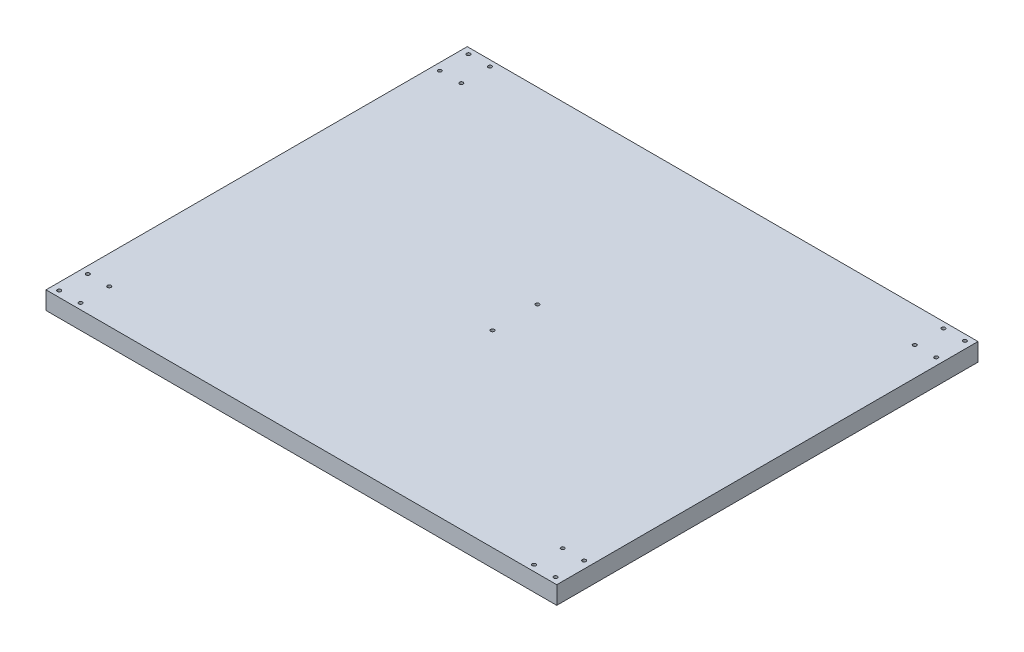
ISO-10303-21;
HEADER;
FILE_DESCRIPTION(('STEP AP214'),'2;1');
FILE_NAME('part.step','',(''),(''),'','','');
FILE_SCHEMA(('AUTOMOTIVE_DESIGN { 1 0 10303 214 1 1 1 1 }'));
ENDSEC;
DATA;
#1=APPLICATION_CONTEXT('core data for automotive mechanical design processes');
#2=APPLICATION_PROTOCOL_DEFINITION('international standard','automotive_design',2000,#1);
#3=PRODUCT_CONTEXT('',#1,'mechanical');
#4=PRODUCT('Part','Part','',(#3));
#5=PRODUCT_RELATED_PRODUCT_CATEGORY('part','',(#4));
#6=PRODUCT_DEFINITION_FORMATION('','',#4);
#7=PRODUCT_DEFINITION_CONTEXT('part definition',#1,'design');
#8=PRODUCT_DEFINITION('design','',#6,#7);
#9=PRODUCT_DEFINITION_SHAPE('','',#8);
#10=(LENGTH_UNIT() NAMED_UNIT(*) SI_UNIT(.MILLI.,.METRE.));
#11=(NAMED_UNIT(*) PLANE_ANGLE_UNIT() SI_UNIT($,.RADIAN.));
#12=(NAMED_UNIT(*) SI_UNIT($,.STERADIAN.) SOLID_ANGLE_UNIT());
#13=UNCERTAINTY_MEASURE_WITH_UNIT(LENGTH_MEASURE(1.E-05),#10,'distance_accuracy_value','');
#14=(GEOMETRIC_REPRESENTATION_CONTEXT(3) GLOBAL_UNCERTAINTY_ASSIGNED_CONTEXT((#13)) GLOBAL_UNIT_ASSIGNED_CONTEXT((#10,
#11,#12)) REPRESENTATION_CONTEXT('',''));
#15=CARTESIAN_POINT('',(0.,0.,0.));
#16=DIRECTION('',(0.,0.,1.));
#17=DIRECTION('',(1.,0.,0.));
#18=AXIS2_PLACEMENT_3D('',#15,#16,#17);
#19=CARTESIAN_POINT('',(0.,15.,0.));
#20=DIRECTION('',(0.,-1.,0.));
#21=DIRECTION('',(0.,0.,-1.));
#22=AXIS2_PLACEMENT_3D('',#19,#20,#21);
#23=PLANE('',#22);
#24=CARTESIAN_POINT('',(208.,15.,-147.5));
#25=DIRECTION('',(0.,1.,0.));
#26=DIRECTION('',(0.,0.,-1.));
#27=AXIS2_PLACEMENT_3D('',#24,#25,#26);
#28=CIRCLE('',#27,1.5);
#29=CARTESIAN_POINT('',(208.,15.,-149.));
#30=VERTEX_POINT('',#29);
#31=EDGE_CURVE('E214',#30,#30,#28,.T.);
#32=ORIENTED_EDGE('',*,*,#31,.F.);
#33=EDGE_LOOP('',(#32));
#34=FACE_BOUND('',#33,.T.);
#35=CARTESIAN_POINT('',(190.,15.,-147.5));
#36=DIRECTION('',(0.,1.,0.));
#37=DIRECTION('',(0.,0.,-1.));
#38=AXIS2_PLACEMENT_3D('',#35,#36,#37);
#39=CIRCLE('',#38,1.5);
#40=CARTESIAN_POINT('',(190.,15.,-149.));
#41=VERTEX_POINT('',#40);
#42=EDGE_CURVE('E208',#41,#41,#39,.T.);
#43=ORIENTED_EDGE('',*,*,#42,.F.);
#44=EDGE_LOOP('',(#43));
#45=FACE_BOUND('',#44,.T.);
#46=CARTESIAN_POINT('',(190.,15.,-171.5));
#47=DIRECTION('',(0.,1.,0.));
#48=DIRECTION('',(0.,0.,-1.));
#49=AXIS2_PLACEMENT_3D('',#46,#47,#48);
#50=CIRCLE('',#49,1.5);
#51=CARTESIAN_POINT('',(190.,15.,-173.));
#52=VERTEX_POINT('',#51);
#53=EDGE_CURVE('E202',#52,#52,#50,.T.);
#54=ORIENTED_EDGE('',*,*,#53,.F.);
#55=EDGE_LOOP('',(#54));
#56=FACE_BOUND('',#55,.T.);
#57=CARTESIAN_POINT('',(208.,15.,-171.5));
#58=DIRECTION('',(0.,1.,0.));
#59=DIRECTION('',(0.,0.,-1.));
#60=AXIS2_PLACEMENT_3D('',#57,#58,#59);
#61=CIRCLE('',#60,1.5);
#62=CARTESIAN_POINT('',(208.,15.,-173.));
#63=VERTEX_POINT('',#62);
#64=EDGE_CURVE('E196',#63,#63,#61,.T.);
#65=ORIENTED_EDGE('',*,*,#64,.F.);
#66=EDGE_LOOP('',(#65));
#67=FACE_BOUND('',#66,.T.);
#68=CARTESIAN_POINT('',(-208.,15.,-147.5));
#69=DIRECTION('',(0.,1.,0.));
#70=DIRECTION('',(0.,0.,1.));
#71=AXIS2_PLACEMENT_3D('',#68,#69,#70);
#72=CIRCLE('',#71,1.5);
#73=CARTESIAN_POINT('',(-208.,15.,-146.));
#74=VERTEX_POINT('',#73);
#75=EDGE_CURVE('E190',#74,#74,#72,.T.);
#76=ORIENTED_EDGE('',*,*,#75,.F.);
#77=EDGE_LOOP('',(#76));
#78=FACE_BOUND('',#77,.T.);
#79=CARTESIAN_POINT('',(-190.,15.,-147.5));
#80=DIRECTION('',(0.,1.,0.));
#81=DIRECTION('',(0.,0.,1.));
#82=AXIS2_PLACEMENT_3D('',#79,#80,#81);
#83=CIRCLE('',#82,1.5);
#84=CARTESIAN_POINT('',(-190.,15.,-146.));
#85=VERTEX_POINT('',#84);
#86=EDGE_CURVE('E184',#85,#85,#83,.T.);
#87=ORIENTED_EDGE('',*,*,#86,.F.);
#88=EDGE_LOOP('',(#87));
#89=FACE_BOUND('',#88,.T.);
#90=CARTESIAN_POINT('',(-190.,15.,-171.5));
#91=DIRECTION('',(0.,1.,0.));
#92=DIRECTION('',(0.,0.,1.));
#93=AXIS2_PLACEMENT_3D('',#90,#91,#92);
#94=CIRCLE('',#93,1.5);
#95=CARTESIAN_POINT('',(-190.,15.,-170.));
#96=VERTEX_POINT('',#95);
#97=EDGE_CURVE('E178',#96,#96,#94,.T.);
#98=ORIENTED_EDGE('',*,*,#97,.F.);
#99=EDGE_LOOP('',(#98));
#100=FACE_BOUND('',#99,.T.);
#101=CARTESIAN_POINT('',(-208.,15.,-171.5));
#102=DIRECTION('',(0.,1.,0.));
#103=DIRECTION('',(0.,0.,1.));
#104=AXIS2_PLACEMENT_3D('',#101,#102,#103);
#105=CIRCLE('',#104,1.5);
#106=CARTESIAN_POINT('',(-208.,15.,-170.));
#107=VERTEX_POINT('',#106);
#108=EDGE_CURVE('E172',#107,#107,#105,.T.);
#109=ORIENTED_EDGE('',*,*,#108,.F.);
#110=EDGE_LOOP('',(#109));
#111=FACE_BOUND('',#110,.T.);
#112=CARTESIAN_POINT('',(-190.,15.,147.5));
#113=DIRECTION('',(0.,1.,0.));
#114=DIRECTION('',(0.,0.,-1.));
#115=AXIS2_PLACEMENT_3D('',#112,#113,#114);
#116=CIRCLE('',#115,1.5);
#117=CARTESIAN_POINT('',(-190.,15.,146.));
#118=VERTEX_POINT('',#117);
#119=EDGE_CURVE('E166',#118,#118,#116,.T.);
#120=ORIENTED_EDGE('',*,*,#119,.F.);
#121=EDGE_LOOP('',(#120));
#122=FACE_BOUND('',#121,.T.);
#123=CARTESIAN_POINT('',(-208.,15.,147.5));
#124=DIRECTION('',(0.,1.,0.));
#125=DIRECTION('',(0.,0.,-1.));
#126=AXIS2_PLACEMENT_3D('',#123,#124,#125);
#127=CIRCLE('',#126,1.5);
#128=CARTESIAN_POINT('',(-208.,15.,146.));
#129=VERTEX_POINT('',#128);
#130=EDGE_CURVE('E160',#129,#129,#127,.T.);
#131=ORIENTED_EDGE('',*,*,#130,.F.);
#132=EDGE_LOOP('',(#131));
#133=FACE_BOUND('',#132,.T.);
#134=CARTESIAN_POINT('',(-190.,15.,171.5));
#135=DIRECTION('',(0.,1.,0.));
#136=DIRECTION('',(0.,0.,-1.));
#137=AXIS2_PLACEMENT_3D('',#134,#135,#136);
#138=CIRCLE('',#137,1.5);
#139=CARTESIAN_POINT('',(-190.,15.,170.));
#140=VERTEX_POINT('',#139);
#141=EDGE_CURVE('E154',#140,#140,#138,.T.);
#142=ORIENTED_EDGE('',*,*,#141,.F.);
#143=EDGE_LOOP('',(#142));
#144=FACE_BOUND('',#143,.T.);
#145=CARTESIAN_POINT('',(-208.,15.,171.5));
#146=DIRECTION('',(0.,1.,0.));
#147=DIRECTION('',(0.,0.,-1.));
#148=AXIS2_PLACEMENT_3D('',#145,#146,#147);
#149=CIRCLE('',#148,1.5);
#150=CARTESIAN_POINT('',(-208.,15.,170.));
#151=VERTEX_POINT('',#150);
#152=EDGE_CURVE('E148',#151,#151,#149,.T.);
#153=ORIENTED_EDGE('',*,*,#152,.F.);
#154=EDGE_LOOP('',(#153));
#155=FACE_BOUND('',#154,.T.);
#156=CARTESIAN_POINT('',(208.,15.,147.5));
#157=DIRECTION('',(0.,1.,0.));
#158=DIRECTION('',(0.,0.,1.));
#159=AXIS2_PLACEMENT_3D('',#156,#157,#158);
#160=CIRCLE('',#159,1.5);
#161=CARTESIAN_POINT('',(208.,15.,149.));
#162=VERTEX_POINT('',#161);
#163=EDGE_CURVE('E142',#162,#162,#160,.T.);
#164=ORIENTED_EDGE('',*,*,#163,.F.);
#165=EDGE_LOOP('',(#164));
#166=FACE_BOUND('',#165,.T.);
#167=CARTESIAN_POINT('',(190.,15.,147.5));
#168=DIRECTION('',(0.,1.,0.));
#169=DIRECTION('',(0.,0.,1.));
#170=AXIS2_PLACEMENT_3D('',#167,#168,#169);
#171=CIRCLE('',#170,1.5);
#172=CARTESIAN_POINT('',(190.,15.,149.));
#173=VERTEX_POINT('',#172);
#174=EDGE_CURVE('E136',#173,#173,#171,.T.);
#175=ORIENTED_EDGE('',*,*,#174,.F.);
#176=EDGE_LOOP('',(#175));
#177=FACE_BOUND('',#176,.T.);
#178=CARTESIAN_POINT('',(190.,15.,171.5));
#179=DIRECTION('',(0.,1.,0.));
#180=DIRECTION('',(0.,0.,1.));
#181=AXIS2_PLACEMENT_3D('',#178,#179,#180);
#182=CIRCLE('',#181,1.5);
#183=CARTESIAN_POINT('',(190.,15.,173.));
#184=VERTEX_POINT('',#183);
#185=EDGE_CURVE('E130',#184,#184,#182,.T.);
#186=ORIENTED_EDGE('',*,*,#185,.F.);
#187=EDGE_LOOP('',(#186));
#188=FACE_BOUND('',#187,.T.);
#189=CARTESIAN_POINT('',(208.,15.,171.5));
#190=DIRECTION('',(0.,1.,0.));
#191=DIRECTION('',(0.,0.,1.));
#192=AXIS2_PLACEMENT_3D('',#189,#190,#191);
#193=CIRCLE('',#192,1.5);
#194=CARTESIAN_POINT('',(208.,15.,173.));
#195=VERTEX_POINT('',#194);
#196=EDGE_CURVE('E124',#195,#195,#193,.T.);
#197=ORIENTED_EDGE('',*,*,#196,.F.);
#198=EDGE_LOOP('',(#197));
#199=FACE_BOUND('',#198,.T.);
#200=CARTESIAN_POINT('',(2.5,15.,-18.8));
#201=DIRECTION('',(0.,1.,0.));
#202=DIRECTION('',(0.,0.,1.));
#203=AXIS2_PLACEMENT_3D('',#200,#201,#202);
#204=CIRCLE('',#203,1.5);
#205=CARTESIAN_POINT('',(2.5,15.,-17.3));
#206=VERTEX_POINT('',#205);
#207=EDGE_CURVE('E100',#206,#206,#204,.T.);
#208=ORIENTED_EDGE('',*,*,#207,.F.);
#209=EDGE_LOOP('',(#208));
#210=FACE_BOUND('',#209,.T.);
#211=DIRECTION('',(0.,0.,-1.));
#212=VECTOR('',#211,1.);
#213=CARTESIAN_POINT('',(214.,15.,176.5));
#214=LINE('',#213,#212);
#215=CARTESIAN_POINT('',(214.,15.,176.5));
#216=VERTEX_POINT('',#215);
#217=CARTESIAN_POINT('',(214.,15.,-176.5));
#218=VERTEX_POINT('',#217);
#219=EDGE_CURVE('E85',#216,#218,#214,.T.);
#220=ORIENTED_EDGE('',*,*,#219,.T.);
#221=DIRECTION('',(-1.,0.,0.));
#222=VECTOR('',#221,1.);
#223=CARTESIAN_POINT('',(-214.,15.,-176.5));
#224=LINE('',#223,#222);
#225=CARTESIAN_POINT('',(-214.,15.,-176.5));
#226=VERTEX_POINT('',#225);
#227=EDGE_CURVE('E80',#218,#226,#224,.T.);
#228=ORIENTED_EDGE('',*,*,#227,.T.);
#229=DIRECTION('',(0.,0.,1.));
#230=VECTOR('',#229,1.);
#231=CARTESIAN_POINT('',(-214.,15.,176.5));
#232=LINE('',#231,#230);
#233=CARTESIAN_POINT('',(-214.,15.,176.5));
#234=VERTEX_POINT('',#233);
#235=EDGE_CURVE('E83',#226,#234,#232,.T.);
#236=ORIENTED_EDGE('',*,*,#235,.T.);
#237=DIRECTION('',(1.,0.,0.));
#238=VECTOR('',#237,1.);
#239=CARTESIAN_POINT('',(-214.,15.,176.5));
#240=LINE('',#239,#238);
#241=EDGE_CURVE('E50',#234,#216,#240,.T.);
#242=ORIENTED_EDGE('',*,*,#241,.T.);
#243=EDGE_LOOP('',(#220,#228,#236,#242));
#244=FACE_BOUND('',#243,.T.);
#245=CARTESIAN_POINT('',(2.5,15.,18.8));
#246=DIRECTION('',(0.,1.,0.));
#247=DIRECTION('',(0.,0.,1.));
#248=AXIS2_PLACEMENT_3D('',#245,#246,#247);
#249=CIRCLE('',#248,1.5);
#250=CARTESIAN_POINT('',(2.5,15.,20.3));
#251=VERTEX_POINT('',#250);
#252=EDGE_CURVE('E115',#251,#251,#249,.T.);
#253=ORIENTED_EDGE('',*,*,#252,.F.);
#254=EDGE_LOOP('',(#253));
#255=FACE_BOUND('',#254,.T.);
#256=ADVANCED_FACE('F33',(#34,#45,#56,#67,#78,#89,#100,#111,#122,#133,#144,#155,#166,#177,#188,
#199,#210,#244,#255),#23,.F.);
#257=CARTESIAN_POINT('',(0.,0.,0.));
#258=DIRECTION('',(0.,-1.,0.));
#259=DIRECTION('',(0.,0.,-1.));
#260=AXIS2_PLACEMENT_3D('',#257,#258,#259);
#261=PLANE('',#260);
#262=CARTESIAN_POINT('',(208.,0.,-147.5));
#263=DIRECTION('',(0.,1.,0.));
#264=DIRECTION('',(0.,0.,-1.));
#265=AXIS2_PLACEMENT_3D('',#262,#263,#264);
#266=CIRCLE('',#265,1.5);
#267=CARTESIAN_POINT('',(208.,0.,-149.));
#268=VERTEX_POINT('',#267);
#269=EDGE_CURVE('E211',#268,#268,#266,.T.);
#270=ORIENTED_EDGE('',*,*,#269,.T.);
#271=EDGE_LOOP('',(#270));
#272=FACE_BOUND('',#271,.T.);
#273=CARTESIAN_POINT('',(190.,0.,-147.5));
#274=DIRECTION('',(0.,1.,0.));
#275=DIRECTION('',(0.,0.,-1.));
#276=AXIS2_PLACEMENT_3D('',#273,#274,#275);
#277=CIRCLE('',#276,1.5);
#278=CARTESIAN_POINT('',(190.,0.,-149.));
#279=VERTEX_POINT('',#278);
#280=EDGE_CURVE('E205',#279,#279,#277,.T.);
#281=ORIENTED_EDGE('',*,*,#280,.T.);
#282=EDGE_LOOP('',(#281));
#283=FACE_BOUND('',#282,.T.);
#284=CARTESIAN_POINT('',(190.,0.,-171.5));
#285=DIRECTION('',(0.,1.,0.));
#286=DIRECTION('',(0.,0.,-1.));
#287=AXIS2_PLACEMENT_3D('',#284,#285,#286);
#288=CIRCLE('',#287,1.5);
#289=CARTESIAN_POINT('',(190.,0.,-173.));
#290=VERTEX_POINT('',#289);
#291=EDGE_CURVE('E199',#290,#290,#288,.T.);
#292=ORIENTED_EDGE('',*,*,#291,.T.);
#293=EDGE_LOOP('',(#292));
#294=FACE_BOUND('',#293,.T.);
#295=CARTESIAN_POINT('',(208.,0.,-171.5));
#296=DIRECTION('',(0.,1.,0.));
#297=DIRECTION('',(0.,0.,-1.));
#298=AXIS2_PLACEMENT_3D('',#295,#296,#297);
#299=CIRCLE('',#298,1.5);
#300=CARTESIAN_POINT('',(208.,0.,-173.));
#301=VERTEX_POINT('',#300);
#302=EDGE_CURVE('E193',#301,#301,#299,.T.);
#303=ORIENTED_EDGE('',*,*,#302,.T.);
#304=EDGE_LOOP('',(#303));
#305=FACE_BOUND('',#304,.T.);
#306=CARTESIAN_POINT('',(-208.,0.,-147.5));
#307=DIRECTION('',(0.,1.,0.));
#308=DIRECTION('',(0.,0.,1.));
#309=AXIS2_PLACEMENT_3D('',#306,#307,#308);
#310=CIRCLE('',#309,1.5);
#311=CARTESIAN_POINT('',(-208.,0.,-146.));
#312=VERTEX_POINT('',#311);
#313=EDGE_CURVE('E187',#312,#312,#310,.T.);
#314=ORIENTED_EDGE('',*,*,#313,.T.);
#315=EDGE_LOOP('',(#314));
#316=FACE_BOUND('',#315,.T.);
#317=CARTESIAN_POINT('',(-190.,0.,-147.5));
#318=DIRECTION('',(0.,1.,0.));
#319=DIRECTION('',(0.,0.,1.));
#320=AXIS2_PLACEMENT_3D('',#317,#318,#319);
#321=CIRCLE('',#320,1.5);
#322=CARTESIAN_POINT('',(-190.,0.,-146.));
#323=VERTEX_POINT('',#322);
#324=EDGE_CURVE('E181',#323,#323,#321,.T.);
#325=ORIENTED_EDGE('',*,*,#324,.T.);
#326=EDGE_LOOP('',(#325));
#327=FACE_BOUND('',#326,.T.);
#328=CARTESIAN_POINT('',(-190.,0.,-171.5));
#329=DIRECTION('',(0.,1.,0.));
#330=DIRECTION('',(0.,0.,1.));
#331=AXIS2_PLACEMENT_3D('',#328,#329,#330);
#332=CIRCLE('',#331,1.5);
#333=CARTESIAN_POINT('',(-190.,0.,-170.));
#334=VERTEX_POINT('',#333);
#335=EDGE_CURVE('E175',#334,#334,#332,.T.);
#336=ORIENTED_EDGE('',*,*,#335,.T.);
#337=EDGE_LOOP('',(#336));
#338=FACE_BOUND('',#337,.T.);
#339=CARTESIAN_POINT('',(-208.,0.,-171.5));
#340=DIRECTION('',(0.,1.,0.));
#341=DIRECTION('',(0.,0.,1.));
#342=AXIS2_PLACEMENT_3D('',#339,#340,#341);
#343=CIRCLE('',#342,1.5);
#344=CARTESIAN_POINT('',(-208.,0.,-170.));
#345=VERTEX_POINT('',#344);
#346=EDGE_CURVE('E169',#345,#345,#343,.T.);
#347=ORIENTED_EDGE('',*,*,#346,.T.);
#348=EDGE_LOOP('',(#347));
#349=FACE_BOUND('',#348,.T.);
#350=CARTESIAN_POINT('',(-190.,0.,147.5));
#351=DIRECTION('',(0.,1.,0.));
#352=DIRECTION('',(0.,0.,-1.));
#353=AXIS2_PLACEMENT_3D('',#350,#351,#352);
#354=CIRCLE('',#353,1.5);
#355=CARTESIAN_POINT('',(-190.,0.,146.));
#356=VERTEX_POINT('',#355);
#357=EDGE_CURVE('E163',#356,#356,#354,.T.);
#358=ORIENTED_EDGE('',*,*,#357,.T.);
#359=EDGE_LOOP('',(#358));
#360=FACE_BOUND('',#359,.T.);
#361=CARTESIAN_POINT('',(-208.,0.,147.5));
#362=DIRECTION('',(0.,1.,0.));
#363=DIRECTION('',(0.,0.,-1.));
#364=AXIS2_PLACEMENT_3D('',#361,#362,#363);
#365=CIRCLE('',#364,1.5);
#366=CARTESIAN_POINT('',(-208.,0.,146.));
#367=VERTEX_POINT('',#366);
#368=EDGE_CURVE('E157',#367,#367,#365,.T.);
#369=ORIENTED_EDGE('',*,*,#368,.T.);
#370=EDGE_LOOP('',(#369));
#371=FACE_BOUND('',#370,.T.);
#372=CARTESIAN_POINT('',(-190.,0.,171.5));
#373=DIRECTION('',(0.,1.,0.));
#374=DIRECTION('',(0.,0.,-1.));
#375=AXIS2_PLACEMENT_3D('',#372,#373,#374);
#376=CIRCLE('',#375,1.5);
#377=CARTESIAN_POINT('',(-190.,0.,170.));
#378=VERTEX_POINT('',#377);
#379=EDGE_CURVE('E151',#378,#378,#376,.T.);
#380=ORIENTED_EDGE('',*,*,#379,.T.);
#381=EDGE_LOOP('',(#380));
#382=FACE_BOUND('',#381,.T.);
#383=CARTESIAN_POINT('',(-208.,0.,171.5));
#384=DIRECTION('',(0.,1.,0.));
#385=DIRECTION('',(0.,0.,-1.));
#386=AXIS2_PLACEMENT_3D('',#383,#384,#385);
#387=CIRCLE('',#386,1.5);
#388=CARTESIAN_POINT('',(-208.,0.,170.));
#389=VERTEX_POINT('',#388);
#390=EDGE_CURVE('E145',#389,#389,#387,.T.);
#391=ORIENTED_EDGE('',*,*,#390,.T.);
#392=EDGE_LOOP('',(#391));
#393=FACE_BOUND('',#392,.T.);
#394=CARTESIAN_POINT('',(208.,0.,147.5));
#395=DIRECTION('',(0.,1.,0.));
#396=DIRECTION('',(0.,0.,1.));
#397=AXIS2_PLACEMENT_3D('',#394,#395,#396);
#398=CIRCLE('',#397,1.5);
#399=CARTESIAN_POINT('',(208.,0.,149.));
#400=VERTEX_POINT('',#399);
#401=EDGE_CURVE('E139',#400,#400,#398,.T.);
#402=ORIENTED_EDGE('',*,*,#401,.T.);
#403=EDGE_LOOP('',(#402));
#404=FACE_BOUND('',#403,.T.);
#405=CARTESIAN_POINT('',(190.,0.,147.5));
#406=DIRECTION('',(0.,1.,0.));
#407=DIRECTION('',(0.,0.,1.));
#408=AXIS2_PLACEMENT_3D('',#405,#406,#407);
#409=CIRCLE('',#408,1.5);
#410=CARTESIAN_POINT('',(190.,0.,149.));
#411=VERTEX_POINT('',#410);
#412=EDGE_CURVE('E133',#411,#411,#409,.T.);
#413=ORIENTED_EDGE('',*,*,#412,.T.);
#414=EDGE_LOOP('',(#413));
#415=FACE_BOUND('',#414,.T.);
#416=CARTESIAN_POINT('',(190.,0.,171.5));
#417=DIRECTION('',(0.,1.,0.));
#418=DIRECTION('',(0.,0.,1.));
#419=AXIS2_PLACEMENT_3D('',#416,#417,#418);
#420=CIRCLE('',#419,1.5);
#421=CARTESIAN_POINT('',(190.,0.,173.));
#422=VERTEX_POINT('',#421);
#423=EDGE_CURVE('E127',#422,#422,#420,.T.);
#424=ORIENTED_EDGE('',*,*,#423,.T.);
#425=EDGE_LOOP('',(#424));
#426=FACE_BOUND('',#425,.T.);
#427=CARTESIAN_POINT('',(208.,0.,171.5));
#428=DIRECTION('',(0.,1.,0.));
#429=DIRECTION('',(0.,0.,1.));
#430=AXIS2_PLACEMENT_3D('',#427,#428,#429);
#431=CIRCLE('',#430,1.5);
#432=CARTESIAN_POINT('',(208.,0.,173.));
#433=VERTEX_POINT('',#432);
#434=EDGE_CURVE('E121',#433,#433,#431,.T.);
#435=ORIENTED_EDGE('',*,*,#434,.T.);
#436=EDGE_LOOP('',(#435));
#437=FACE_BOUND('',#436,.T.);
#438=CARTESIAN_POINT('',(2.5,0.,-18.8));
#439=DIRECTION('',(0.,1.,0.));
#440=DIRECTION('',(0.,0.,1.));
#441=AXIS2_PLACEMENT_3D('',#438,#439,#440);
#442=CIRCLE('',#441,1.5);
#443=CARTESIAN_POINT('',(2.5,0.,-17.3));
#444=VERTEX_POINT('',#443);
#445=EDGE_CURVE('E112',#444,#444,#442,.T.);
#446=ORIENTED_EDGE('',*,*,#445,.T.);
#447=EDGE_LOOP('',(#446));
#448=FACE_BOUND('',#447,.T.);
#449=DIRECTION('',(0.,0.,-1.));
#450=VECTOR('',#449,1.);
#451=CARTESIAN_POINT('',(214.,0.,176.5));
#452=LINE('',#451,#450);
#453=CARTESIAN_POINT('',(214.,0.,176.5));
#454=VERTEX_POINT('',#453);
#455=CARTESIAN_POINT('',(214.,0.,-176.5));
#456=VERTEX_POINT('',#455);
#457=EDGE_CURVE('E97',#454,#456,#452,.T.);
#458=ORIENTED_EDGE('',*,*,#457,.F.);
#459=DIRECTION('',(1.,0.,0.));
#460=VECTOR('',#459,1.);
#461=CARTESIAN_POINT('',(-214.,0.,176.5));
#462=LINE('',#461,#460);
#463=CARTESIAN_POINT('',(-214.,0.,176.5));
#464=VERTEX_POINT('',#463);
#465=EDGE_CURVE('E73',#464,#454,#462,.T.);
#466=ORIENTED_EDGE('',*,*,#465,.F.);
#467=DIRECTION('',(0.,0.,1.));
#468=VECTOR('',#467,1.);
#469=CARTESIAN_POINT('',(-214.,0.,176.5));
#470=LINE('',#469,#468);
#471=CARTESIAN_POINT('',(-214.,0.,-176.5));
#472=VERTEX_POINT('',#471);
#473=EDGE_CURVE('E67',#472,#464,#470,.T.);
#474=ORIENTED_EDGE('',*,*,#473,.F.);
#475=DIRECTION('',(-1.,0.,0.));
#476=VECTOR('',#475,1.);
#477=CARTESIAN_POINT('',(-214.,0.,-176.5));
#478=LINE('',#477,#476);
#479=EDGE_CURVE('E89',#456,#472,#478,.T.);
#480=ORIENTED_EDGE('',*,*,#479,.F.);
#481=EDGE_LOOP('',(#458,#466,#474,#480));
#482=FACE_BOUND('',#481,.T.);
#483=CARTESIAN_POINT('',(2.5,0.,18.8));
#484=DIRECTION('',(0.,1.,0.));
#485=DIRECTION('',(0.,0.,1.));
#486=AXIS2_PLACEMENT_3D('',#483,#484,#485);
#487=CIRCLE('',#486,1.5);
#488=CARTESIAN_POINT('',(2.5,0.,20.3));
#489=VERTEX_POINT('',#488);
#490=EDGE_CURVE('E118',#489,#489,#487,.T.);
#491=ORIENTED_EDGE('',*,*,#490,.T.);
#492=EDGE_LOOP('',(#491));
#493=FACE_BOUND('',#492,.T.);
#494=ADVANCED_FACE('F108',(#272,#283,#294,#305,#316,#327,#338,#349,#360,#371,#382,#393,#404,
#415,#426,#437,#448,#482,#493),#261,.T.);
#495=CARTESIAN_POINT('',(214.,15.,176.5));
#496=DIRECTION('',(-1.,0.,0.));
#497=DIRECTION('',(0.,0.,1.));
#498=AXIS2_PLACEMENT_3D('',#495,#496,#497);
#499=PLANE('',#498);
#500=ORIENTED_EDGE('',*,*,#457,.T.);
#501=DIRECTION('',(0.,-1.,0.));
#502=VECTOR('',#501,1.);
#503=CARTESIAN_POINT('',(214.,15.,-176.5));
#504=LINE('',#503,#502);
#505=EDGE_CURVE('E11',#218,#456,#504,.T.);
#506=ORIENTED_EDGE('',*,*,#505,.F.);
#507=ORIENTED_EDGE('',*,*,#219,.F.);
#508=DIRECTION('',(0.,-1.,0.));
#509=VECTOR('',#508,1.);
#510=CARTESIAN_POINT('',(214.,15.,176.5));
#511=LINE('',#510,#509);
#512=EDGE_CURVE('E93',#216,#454,#511,.T.);
#513=ORIENTED_EDGE('',*,*,#512,.T.);
#514=EDGE_LOOP('',(#500,#506,#507,#513));
#515=FACE_BOUND('',#514,.T.);
#516=ADVANCED_FACE('F35',(#515),#499,.F.);
#517=CARTESIAN_POINT('',(-214.,15.,-176.5));
#518=DIRECTION('',(0.,0.,1.));
#519=DIRECTION('',(1.,0.,0.));
#520=AXIS2_PLACEMENT_3D('',#517,#518,#519);
#521=PLANE('',#520);
#522=ORIENTED_EDGE('',*,*,#479,.T.);
#523=DIRECTION('',(0.,-1.,0.));
#524=VECTOR('',#523,1.);
#525=CARTESIAN_POINT('',(-214.,15.,-176.5));
#526=LINE('',#525,#524);
#527=EDGE_CURVE('E42',#226,#472,#526,.T.);
#528=ORIENTED_EDGE('',*,*,#527,.F.);
#529=ORIENTED_EDGE('',*,*,#227,.F.);
#530=ORIENTED_EDGE('',*,*,#505,.T.);
#531=EDGE_LOOP('',(#522,#528,#529,#530));
#532=FACE_BOUND('',#531,.T.);
#533=ADVANCED_FACE('F88',(#532),#521,.F.);
#534=CARTESIAN_POINT('',(-214.,15.,176.5));
#535=DIRECTION('',(1.,0.,0.));
#536=DIRECTION('',(0.,0.,-1.));
#537=AXIS2_PLACEMENT_3D('',#534,#535,#536);
#538=PLANE('',#537);
#539=ORIENTED_EDGE('',*,*,#473,.T.);
#540=DIRECTION('',(0.,-1.,0.));
#541=VECTOR('',#540,1.);
#542=CARTESIAN_POINT('',(-214.,15.,176.5));
#543=LINE('',#542,#541);
#544=EDGE_CURVE('E90',#234,#464,#543,.T.);
#545=ORIENTED_EDGE('',*,*,#544,.F.);
#546=ORIENTED_EDGE('',*,*,#235,.F.);
#547=ORIENTED_EDGE('',*,*,#527,.T.);
#548=EDGE_LOOP('',(#539,#545,#546,#547));
#549=FACE_BOUND('',#548,.T.);
#550=ADVANCED_FACE('F91',(#549),#538,.F.);
#551=CARTESIAN_POINT('',(-214.,15.,176.5));
#552=DIRECTION('',(0.,0.,-1.));
#553=DIRECTION('',(-1.,0.,0.));
#554=AXIS2_PLACEMENT_3D('',#551,#552,#553);
#555=PLANE('',#554);
#556=ORIENTED_EDGE('',*,*,#465,.T.);
#557=ORIENTED_EDGE('',*,*,#512,.F.);
#558=ORIENTED_EDGE('',*,*,#241,.F.);
#559=ORIENTED_EDGE('',*,*,#544,.T.);
#560=EDGE_LOOP('',(#556,#557,#558,#559));
#561=FACE_BOUND('',#560,.T.);
#562=ADVANCED_FACE('F105',(#561),#555,.F.);
#563=CARTESIAN_POINT('',(2.5,15.,-18.8));
#564=DIRECTION('',(0.,-1.,0.));
#565=DIRECTION('',(0.,0.,-1.));
#566=AXIS2_PLACEMENT_3D('',#563,#564,#565);
#567=CYLINDRICAL_SURFACE('',#566,1.5);
#568=ORIENTED_EDGE('',*,*,#207,.T.);
#569=EDGE_LOOP('',(#568));
#570=FACE_BOUND('',#569,.T.);
#571=ORIENTED_EDGE('',*,*,#445,.F.);
#572=EDGE_LOOP('',(#571));
#573=FACE_BOUND('',#572,.T.);
#574=ADVANCED_FACE('F264',(#570,#573),#567,.F.);
#575=CARTESIAN_POINT('',(2.5,15.,18.8));
#576=DIRECTION('',(0.,-1.,0.));
#577=DIRECTION('',(0.,0.,-1.));
#578=AXIS2_PLACEMENT_3D('',#575,#576,#577);
#579=CYLINDRICAL_SURFACE('',#578,1.5);
#580=ORIENTED_EDGE('',*,*,#252,.T.);
#581=EDGE_LOOP('',(#580));
#582=FACE_BOUND('',#581,.T.);
#583=ORIENTED_EDGE('',*,*,#490,.F.);
#584=EDGE_LOOP('',(#583));
#585=FACE_BOUND('',#584,.T.);
#586=ADVANCED_FACE('F267',(#582,#585),#579,.F.);
#587=CARTESIAN_POINT('',(208.,0.,171.5));
#588=DIRECTION('',(0.,1.,0.));
#589=DIRECTION('',(0.,0.,1.));
#590=AXIS2_PLACEMENT_3D('',#587,#588,#589);
#591=CYLINDRICAL_SURFACE('',#590,1.5);
#592=ORIENTED_EDGE('',*,*,#434,.F.);
#593=EDGE_LOOP('',(#592));
#594=FACE_BOUND('',#593,.T.);
#595=ORIENTED_EDGE('',*,*,#196,.T.);
#596=EDGE_LOOP('',(#595));
#597=FACE_BOUND('',#596,.T.);
#598=ADVANCED_FACE('F304',(#594,#597),#591,.F.);
#599=CARTESIAN_POINT('',(190.,0.,171.5));
#600=DIRECTION('',(0.,1.,0.));
#601=DIRECTION('',(0.,0.,1.));
#602=AXIS2_PLACEMENT_3D('',#599,#600,#601);
#603=CYLINDRICAL_SURFACE('',#602,1.5);
#604=ORIENTED_EDGE('',*,*,#423,.F.);
#605=EDGE_LOOP('',(#604));
#606=FACE_BOUND('',#605,.T.);
#607=ORIENTED_EDGE('',*,*,#185,.T.);
#608=EDGE_LOOP('',(#607));
#609=FACE_BOUND('',#608,.T.);
#610=ADVANCED_FACE('F311',(#606,#609),#603,.F.);
#611=CARTESIAN_POINT('',(190.,0.,147.5));
#612=DIRECTION('',(0.,1.,0.));
#613=DIRECTION('',(0.,0.,1.));
#614=AXIS2_PLACEMENT_3D('',#611,#612,#613);
#615=CYLINDRICAL_SURFACE('',#614,1.5);
#616=ORIENTED_EDGE('',*,*,#412,.F.);
#617=EDGE_LOOP('',(#616));
#618=FACE_BOUND('',#617,.T.);
#619=ORIENTED_EDGE('',*,*,#174,.T.);
#620=EDGE_LOOP('',(#619));
#621=FACE_BOUND('',#620,.T.);
#622=ADVANCED_FACE('F319',(#618,#621),#615,.F.);
#623=CARTESIAN_POINT('',(208.,0.,147.5));
#624=DIRECTION('',(0.,1.,0.));
#625=DIRECTION('',(0.,0.,1.));
#626=AXIS2_PLACEMENT_3D('',#623,#624,#625);
#627=CYLINDRICAL_SURFACE('',#626,1.5);
#628=ORIENTED_EDGE('',*,*,#401,.F.);
#629=EDGE_LOOP('',(#628));
#630=FACE_BOUND('',#629,.T.);
#631=ORIENTED_EDGE('',*,*,#163,.T.);
#632=EDGE_LOOP('',(#631));
#633=FACE_BOUND('',#632,.T.);
#634=ADVANCED_FACE('F327',(#630,#633),#627,.F.);
#635=CARTESIAN_POINT('',(-208.,0.,171.5));
#636=DIRECTION('',(0.,1.,0.));
#637=DIRECTION('',(0.,0.,1.));
#638=AXIS2_PLACEMENT_3D('',#635,#636,#637);
#639=CYLINDRICAL_SURFACE('',#638,1.5);
#640=ORIENTED_EDGE('',*,*,#390,.F.);
#641=EDGE_LOOP('',(#640));
#642=FACE_BOUND('',#641,.T.);
#643=ORIENTED_EDGE('',*,*,#152,.T.);
#644=EDGE_LOOP('',(#643));
#645=FACE_BOUND('',#644,.T.);
#646=ADVANCED_FACE('F335',(#642,#645),#639,.F.);
#647=CARTESIAN_POINT('',(-190.,0.,171.5));
#648=DIRECTION('',(0.,1.,0.));
#649=DIRECTION('',(0.,0.,1.));
#650=AXIS2_PLACEMENT_3D('',#647,#648,#649);
#651=CYLINDRICAL_SURFACE('',#650,1.5);
#652=ORIENTED_EDGE('',*,*,#379,.F.);
#653=EDGE_LOOP('',(#652));
#654=FACE_BOUND('',#653,.T.);
#655=ORIENTED_EDGE('',*,*,#141,.T.);
#656=EDGE_LOOP('',(#655));
#657=FACE_BOUND('',#656,.T.);
#658=ADVANCED_FACE('F343',(#654,#657),#651,.F.);
#659=CARTESIAN_POINT('',(-208.,0.,147.5));
#660=DIRECTION('',(0.,1.,0.));
#661=DIRECTION('',(0.,0.,1.));
#662=AXIS2_PLACEMENT_3D('',#659,#660,#661);
#663=CYLINDRICAL_SURFACE('',#662,1.5);
#664=ORIENTED_EDGE('',*,*,#368,.F.);
#665=EDGE_LOOP('',(#664));
#666=FACE_BOUND('',#665,.T.);
#667=ORIENTED_EDGE('',*,*,#130,.T.);
#668=EDGE_LOOP('',(#667));
#669=FACE_BOUND('',#668,.T.);
#670=ADVANCED_FACE('F351',(#666,#669),#663,.F.);
#671=CARTESIAN_POINT('',(-190.,0.,147.5));
#672=DIRECTION('',(0.,1.,0.));
#673=DIRECTION('',(0.,0.,1.));
#674=AXIS2_PLACEMENT_3D('',#671,#672,#673);
#675=CYLINDRICAL_SURFACE('',#674,1.5);
#676=ORIENTED_EDGE('',*,*,#357,.F.);
#677=EDGE_LOOP('',(#676));
#678=FACE_BOUND('',#677,.T.);
#679=ORIENTED_EDGE('',*,*,#119,.T.);
#680=EDGE_LOOP('',(#679));
#681=FACE_BOUND('',#680,.T.);
#682=ADVANCED_FACE('F359',(#678,#681),#675,.F.);
#683=CARTESIAN_POINT('',(-208.,0.,-171.5));
#684=DIRECTION('',(0.,1.,0.));
#685=DIRECTION('',(0.,0.,1.));
#686=AXIS2_PLACEMENT_3D('',#683,#684,#685);
#687=CYLINDRICAL_SURFACE('',#686,1.5);
#688=ORIENTED_EDGE('',*,*,#346,.F.);
#689=EDGE_LOOP('',(#688));
#690=FACE_BOUND('',#689,.T.);
#691=ORIENTED_EDGE('',*,*,#108,.T.);
#692=EDGE_LOOP('',(#691));
#693=FACE_BOUND('',#692,.T.);
#694=ADVANCED_FACE('F367',(#690,#693),#687,.F.);
#695=CARTESIAN_POINT('',(-190.,0.,-171.5));
#696=DIRECTION('',(0.,1.,0.));
#697=DIRECTION('',(0.,0.,1.));
#698=AXIS2_PLACEMENT_3D('',#695,#696,#697);
#699=CYLINDRICAL_SURFACE('',#698,1.5);
#700=ORIENTED_EDGE('',*,*,#335,.F.);
#701=EDGE_LOOP('',(#700));
#702=FACE_BOUND('',#701,.T.);
#703=ORIENTED_EDGE('',*,*,#97,.T.);
#704=EDGE_LOOP('',(#703));
#705=FACE_BOUND('',#704,.T.);
#706=ADVANCED_FACE('F375',(#702,#705),#699,.F.);
#707=CARTESIAN_POINT('',(-190.,0.,-147.5));
#708=DIRECTION('',(0.,1.,0.));
#709=DIRECTION('',(0.,0.,1.));
#710=AXIS2_PLACEMENT_3D('',#707,#708,#709);
#711=CYLINDRICAL_SURFACE('',#710,1.5);
#712=ORIENTED_EDGE('',*,*,#324,.F.);
#713=EDGE_LOOP('',(#712));
#714=FACE_BOUND('',#713,.T.);
#715=ORIENTED_EDGE('',*,*,#86,.T.);
#716=EDGE_LOOP('',(#715));
#717=FACE_BOUND('',#716,.T.);
#718=ADVANCED_FACE('F383',(#714,#717),#711,.F.);
#719=CARTESIAN_POINT('',(-208.,0.,-147.5));
#720=DIRECTION('',(0.,1.,0.));
#721=DIRECTION('',(0.,0.,1.));
#722=AXIS2_PLACEMENT_3D('',#719,#720,#721);
#723=CYLINDRICAL_SURFACE('',#722,1.5);
#724=ORIENTED_EDGE('',*,*,#313,.F.);
#725=EDGE_LOOP('',(#724));
#726=FACE_BOUND('',#725,.T.);
#727=ORIENTED_EDGE('',*,*,#75,.T.);
#728=EDGE_LOOP('',(#727));
#729=FACE_BOUND('',#728,.T.);
#730=ADVANCED_FACE('F391',(#726,#729),#723,.F.);
#731=CARTESIAN_POINT('',(208.,0.,-171.5));
#732=DIRECTION('',(0.,1.,0.));
#733=DIRECTION('',(0.,0.,1.));
#734=AXIS2_PLACEMENT_3D('',#731,#732,#733);
#735=CYLINDRICAL_SURFACE('',#734,1.5);
#736=ORIENTED_EDGE('',*,*,#302,.F.);
#737=EDGE_LOOP('',(#736));
#738=FACE_BOUND('',#737,.T.);
#739=ORIENTED_EDGE('',*,*,#64,.T.);
#740=EDGE_LOOP('',(#739));
#741=FACE_BOUND('',#740,.T.);
#742=ADVANCED_FACE('F399',(#738,#741),#735,.F.);
#743=CARTESIAN_POINT('',(190.,0.,-171.5));
#744=DIRECTION('',(0.,1.,0.));
#745=DIRECTION('',(0.,0.,1.));
#746=AXIS2_PLACEMENT_3D('',#743,#744,#745);
#747=CYLINDRICAL_SURFACE('',#746,1.5);
#748=ORIENTED_EDGE('',*,*,#291,.F.);
#749=EDGE_LOOP('',(#748));
#750=FACE_BOUND('',#749,.T.);
#751=ORIENTED_EDGE('',*,*,#53,.T.);
#752=EDGE_LOOP('',(#751));
#753=FACE_BOUND('',#752,.T.);
#754=ADVANCED_FACE('F407',(#750,#753),#747,.F.);
#755=CARTESIAN_POINT('',(190.,0.,-147.5));
#756=DIRECTION('',(0.,1.,0.));
#757=DIRECTION('',(0.,0.,1.));
#758=AXIS2_PLACEMENT_3D('',#755,#756,#757);
#759=CYLINDRICAL_SURFACE('',#758,1.5);
#760=ORIENTED_EDGE('',*,*,#280,.F.);
#761=EDGE_LOOP('',(#760));
#762=FACE_BOUND('',#761,.T.);
#763=ORIENTED_EDGE('',*,*,#42,.T.);
#764=EDGE_LOOP('',(#763));
#765=FACE_BOUND('',#764,.T.);
#766=ADVANCED_FACE('F225',(#762,#765),#759,.F.);
#767=CARTESIAN_POINT('',(208.,0.,-147.5));
#768=DIRECTION('',(0.,1.,0.));
#769=DIRECTION('',(0.,0.,1.));
#770=AXIS2_PLACEMENT_3D('',#767,#768,#769);
#771=CYLINDRICAL_SURFACE('',#770,1.5);
#772=ORIENTED_EDGE('',*,*,#269,.F.);
#773=EDGE_LOOP('',(#772));
#774=FACE_BOUND('',#773,.T.);
#775=ORIENTED_EDGE('',*,*,#31,.T.);
#776=EDGE_LOOP('',(#775));
#777=FACE_BOUND('',#776,.T.);
#778=ADVANCED_FACE('F222',(#774,#777),#771,.F.);
#779=CLOSED_SHELL('',(#256,#494,#516,#533,#550,#562,#574,#586,#598,#610,#622,#634,#646,#658,
#670,#682,#694,#706,#718,#730,#742,#754,#766,#778));
#780=MANIFOLD_SOLID_BREP('B2',#779);
#781=ADVANCED_BREP_SHAPE_REPRESENTATION('',(#18,#780),#14);
#782=SHAPE_DEFINITION_REPRESENTATION(#9,#781);
ENDSEC;
END-ISO-10303-21;
